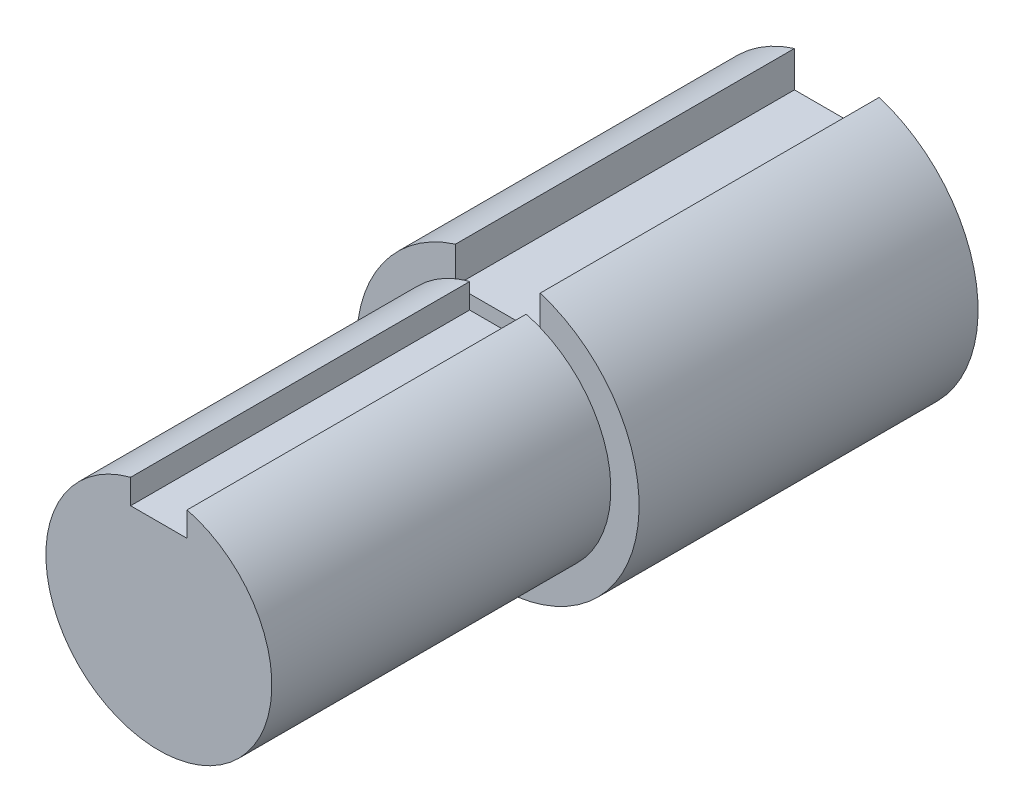
ISO-10303-21;
HEADER;
FILE_DESCRIPTION(('STEP AP214'),'2;1');
FILE_NAME('part.step','',(''),(''),'','','');
FILE_SCHEMA(('AUTOMOTIVE_DESIGN { 1 0 10303 214 1 1 1 1 }'));
ENDSEC;
DATA;
#1=APPLICATION_CONTEXT('core data for automotive mechanical design processes');
#2=APPLICATION_PROTOCOL_DEFINITION('international standard','automotive_design',2000,#1);
#3=PRODUCT_CONTEXT('',#1,'mechanical');
#4=PRODUCT('Part','Part','',(#3));
#5=PRODUCT_RELATED_PRODUCT_CATEGORY('part','',(#4));
#6=PRODUCT_DEFINITION_FORMATION('','',#4);
#7=PRODUCT_DEFINITION_CONTEXT('part definition',#1,'design');
#8=PRODUCT_DEFINITION('design','',#6,#7);
#9=PRODUCT_DEFINITION_SHAPE('','',#8);
#10=(LENGTH_UNIT() NAMED_UNIT(*) SI_UNIT(.MILLI.,.METRE.));
#11=(NAMED_UNIT(*) PLANE_ANGLE_UNIT() SI_UNIT($,.RADIAN.));
#12=(NAMED_UNIT(*) SI_UNIT($,.STERADIAN.) SOLID_ANGLE_UNIT());
#13=UNCERTAINTY_MEASURE_WITH_UNIT(LENGTH_MEASURE(1.E-05),#10,'distance_accuracy_value','');
#14=(GEOMETRIC_REPRESENTATION_CONTEXT(3) GLOBAL_UNCERTAINTY_ASSIGNED_CONTEXT((#13)) GLOBAL_UNIT_ASSIGNED_CONTEXT((#10,
#11,#12)) REPRESENTATION_CONTEXT('',''));
#15=CARTESIAN_POINT('',(0.,0.,0.));
#16=DIRECTION('',(0.,0.,1.));
#17=DIRECTION('',(1.,0.,0.));
#18=AXIS2_PLACEMENT_3D('',#15,#16,#17);
#19=CARTESIAN_POINT('',(0.,0.,19.05));
#20=DIRECTION('',(0.,0.,1.));
#21=DIRECTION('',(1.,0.,0.));
#22=AXIS2_PLACEMENT_3D('',#19,#20,#21);
#23=PLANE('',#22);
#24=CARTESIAN_POINT('',(0.,0.,19.05));
#25=DIRECTION('',(0.,0.,1.));
#26=DIRECTION('',(1.,0.,0.));
#27=AXIS2_PLACEMENT_3D('',#24,#25,#26);
#28=CIRCLE('',#27,6.35);
#29=CARTESIAN_POINT('',(-2.38125,5.88660754913218,19.05));
#30=VERTEX_POINT('',#29);
#31=CARTESIAN_POINT('',(2.38125,5.88660754913218,19.05));
#32=VERTEX_POINT('',#31);
#33=EDGE_CURVE('E11',#30,#32,#28,.T.);
#34=ORIENTED_EDGE('',*,*,#33,.F.);
#35=DIRECTION('',(0.,1.,0.));
#36=VECTOR('',#35,1.);
#37=CARTESIAN_POINT('',(-2.38125,7.57189241124701,19.05));
#38=LINE('',#37,#36);
#39=CARTESIAN_POINT('',(-2.38125,7.57189241124701,19.05));
#40=VERTEX_POINT('',#39);
#41=EDGE_CURVE('E157',#30,#40,#38,.T.);
#42=ORIENTED_EDGE('',*,*,#41,.T.);
#43=CARTESIAN_POINT('',(0.,0.,19.05));
#44=DIRECTION('',(0.,0.,1.));
#45=DIRECTION('',(1.,0.,0.));
#46=AXIS2_PLACEMENT_3D('',#43,#44,#45);
#47=CIRCLE('',#46,7.9375);
#48=CARTESIAN_POINT('',(2.38125,7.57189241124701,19.05));
#49=VERTEX_POINT('',#48);
#50=EDGE_CURVE('E146',#40,#49,#47,.T.);
#51=ORIENTED_EDGE('',*,*,#50,.T.);
#52=DIRECTION('',(0.,-1.,0.));
#53=VECTOR('',#52,1.);
#54=CARTESIAN_POINT('',(2.38125,5.55625,19.05));
#55=LINE('',#54,#53);
#56=EDGE_CURVE('E151',#49,#32,#55,.T.);
#57=ORIENTED_EDGE('',*,*,#56,.T.);
#58=EDGE_LOOP('',(#34,#42,#51,#57));
#59=FACE_BOUND('',#58,.T.);
#60=ADVANCED_FACE('F30',(#59),#23,.T.);
#61=CARTESIAN_POINT('',(0.,0.,19.05));
#62=DIRECTION('',(0.,0.,-1.));
#63=DIRECTION('',(-1.,0.,0.));
#64=AXIS2_PLACEMENT_3D('',#61,#62,#63);
#65=CYLINDRICAL_SURFACE('',#64,7.9375);
#66=CARTESIAN_POINT('',(0.,0.,0.));
#67=DIRECTION('',(0.,0.,1.));
#68=DIRECTION('',(1.,0.,0.));
#69=AXIS2_PLACEMENT_3D('',#66,#67,#68);
#70=CIRCLE('',#69,7.9375);
#71=CARTESIAN_POINT('',(-2.38125,7.57189241124701,0.));
#72=VERTEX_POINT('',#71);
#73=CARTESIAN_POINT('',(2.38125,7.57189241124701,0.));
#74=VERTEX_POINT('',#73);
#75=EDGE_CURVE('E137',#72,#74,#70,.T.);
#76=ORIENTED_EDGE('',*,*,#75,.T.);
#77=DIRECTION('',(0.,0.,-1.));
#78=VECTOR('',#77,1.);
#79=CARTESIAN_POINT('',(2.38125,7.57189241124701,19.05));
#80=LINE('',#79,#78);
#81=EDGE_CURVE('E34',#49,#74,#80,.T.);
#82=ORIENTED_EDGE('',*,*,#81,.F.);
#83=ORIENTED_EDGE('',*,*,#50,.F.);
#84=DIRECTION('',(0.,0.,-1.));
#85=VECTOR('',#84,1.);
#86=CARTESIAN_POINT('',(-2.38125,7.57189241124701,19.05));
#87=LINE('',#86,#85);
#88=EDGE_CURVE('E161',#40,#72,#87,.T.);
#89=ORIENTED_EDGE('',*,*,#88,.T.);
#90=EDGE_LOOP('',(#76,#82,#83,#89));
#91=FACE_BOUND('',#90,.T.);
#92=ADVANCED_FACE('F32',(#91),#65,.T.);
#93=CARTESIAN_POINT('',(2.38125,5.55625,19.05));
#94=DIRECTION('',(1.,0.,0.));
#95=DIRECTION('',(0.,0.,-1.));
#96=AXIS2_PLACEMENT_3D('',#93,#94,#95);
#97=PLANE('',#96);
#98=DIRECTION('',(0.,-1.,0.));
#99=VECTOR('',#98,1.);
#100=CARTESIAN_POINT('',(2.38125,5.55625,0.));
#101=LINE('',#100,#99);
#102=CARTESIAN_POINT('',(2.38125,5.55625,0.));
#103=VERTEX_POINT('',#102);
#104=EDGE_CURVE('E140',#74,#103,#101,.T.);
#105=ORIENTED_EDGE('',*,*,#104,.T.);
#106=DIRECTION('',(0.,0.,-1.));
#107=VECTOR('',#106,1.);
#108=CARTESIAN_POINT('',(2.38125,5.55625,19.05));
#109=LINE('',#108,#107);
#110=CARTESIAN_POINT('',(2.38125,5.55625,19.05));
#111=VERTEX_POINT('',#110);
#112=EDGE_CURVE('E171',#111,#103,#109,.T.);
#113=ORIENTED_EDGE('',*,*,#112,.F.);
#114=EDGE_CURVE('E149',#32,#111,#55,.T.);
#115=ORIENTED_EDGE('',*,*,#114,.F.);
#116=ORIENTED_EDGE('',*,*,#56,.F.);
#117=ORIENTED_EDGE('',*,*,#81,.T.);
#118=EDGE_LOOP('',(#105,#113,#115,#116,#117));
#119=FACE_BOUND('',#118,.T.);
#120=ADVANCED_FACE('F210',(#119),#97,.F.);
#121=CARTESIAN_POINT('',(-2.38125,5.55625,19.05));
#122=DIRECTION('',(0.,-1.,0.));
#123=DIRECTION('',(0.,0.,-1.));
#124=AXIS2_PLACEMENT_3D('',#121,#122,#123);
#125=PLANE('',#124);
#126=DIRECTION('',(-1.,0.,0.));
#127=VECTOR('',#126,1.);
#128=CARTESIAN_POINT('',(-2.38125,5.55625,0.));
#129=LINE('',#128,#127);
#130=CARTESIAN_POINT('',(-2.38125,5.55625,0.));
#131=VERTEX_POINT('',#130);
#132=EDGE_CURVE('E164',#103,#131,#129,.T.);
#133=ORIENTED_EDGE('',*,*,#132,.T.);
#134=DIRECTION('',(0.,0.,-1.));
#135=VECTOR('',#134,1.);
#136=CARTESIAN_POINT('',(-2.38125,5.55625,19.05));
#137=LINE('',#136,#135);
#138=CARTESIAN_POINT('',(-2.38125,5.55625,19.05));
#139=VERTEX_POINT('',#138);
#140=EDGE_CURVE('E169',#139,#131,#137,.T.);
#141=ORIENTED_EDGE('',*,*,#140,.F.);
#142=DIRECTION('',(-1.,0.,0.));
#143=VECTOR('',#142,1.);
#144=CARTESIAN_POINT('',(-2.38125,5.55625,19.05));
#145=LINE('',#144,#143);
#146=CARTESIAN_POINT('',(-1.5875,5.55625,19.05));
#147=VERTEX_POINT('',#146);
#148=EDGE_CURVE('E153',#147,#139,#145,.T.);
#149=ORIENTED_EDGE('',*,*,#148,.F.);
#150=CARTESIAN_POINT('',(1.5875,5.55625,19.05));
#151=VERTEX_POINT('',#150);
#152=EDGE_CURVE('E158',#151,#147,#145,.T.);
#153=ORIENTED_EDGE('',*,*,#152,.F.);
#154=EDGE_CURVE('E154',#111,#151,#145,.T.);
#155=ORIENTED_EDGE('',*,*,#154,.F.);
#156=ORIENTED_EDGE('',*,*,#112,.T.);
#157=EDGE_LOOP('',(#133,#141,#149,#153,#155,#156));
#158=FACE_BOUND('',#157,.T.);
#159=ADVANCED_FACE('F213',(#158),#125,.F.);
#160=CARTESIAN_POINT('',(-2.38125,7.57189241124701,19.05));
#161=DIRECTION('',(-1.,0.,0.));
#162=DIRECTION('',(0.,0.,1.));
#163=AXIS2_PLACEMENT_3D('',#160,#161,#162);
#164=PLANE('',#163);
#165=DIRECTION('',(0.,1.,0.));
#166=VECTOR('',#165,1.);
#167=CARTESIAN_POINT('',(-2.38125,7.57189241124701,0.));
#168=LINE('',#167,#166);
#169=EDGE_CURVE('E150',#131,#72,#168,.T.);
#170=ORIENTED_EDGE('',*,*,#169,.T.);
#171=ORIENTED_EDGE('',*,*,#88,.F.);
#172=ORIENTED_EDGE('',*,*,#41,.F.);
#173=EDGE_CURVE('E159',#139,#30,#38,.T.);
#174=ORIENTED_EDGE('',*,*,#173,.F.);
#175=ORIENTED_EDGE('',*,*,#140,.T.);
#176=EDGE_LOOP('',(#170,#171,#172,#174,#175));
#177=FACE_BOUND('',#176,.T.);
#178=ADVANCED_FACE('F202',(#177),#164,.F.);
#179=DIRECTION('',(0.,1.,0.));
#180=VECTOR('',#179,1.);
#181=CARTESIAN_POINT('',(-1.5875,6.14836106210427,19.05));
#182=LINE('',#181,#180);
#183=CARTESIAN_POINT('',(-1.5875,4.7625,19.05));
#184=VERTEX_POINT('',#183);
#185=EDGE_CURVE('E49',#184,#147,#182,.T.);
#186=ORIENTED_EDGE('',*,*,#185,.F.);
#187=DIRECTION('',(-1.,0.,0.));
#188=VECTOR('',#187,1.);
#189=CARTESIAN_POINT('',(-1.5875,4.7625,19.05));
#190=LINE('',#189,#188);
#191=CARTESIAN_POINT('',(1.5875,4.7625,19.05));
#192=VERTEX_POINT('',#191);
#193=EDGE_CURVE('E182',#192,#184,#190,.T.);
#194=ORIENTED_EDGE('',*,*,#193,.F.);
#195=DIRECTION('',(0.,-1.,0.));
#196=VECTOR('',#195,1.);
#197=CARTESIAN_POINT('',(1.5875,4.7625,19.05));
#198=LINE('',#197,#196);
#199=EDGE_CURVE('E39',#151,#192,#198,.T.);
#200=ORIENTED_EDGE('',*,*,#199,.F.);
#201=ORIENTED_EDGE('',*,*,#152,.T.);
#202=EDGE_LOOP('',(#186,#194,#200,#201));
#203=FACE_BOUND('',#202,.T.);
#204=ADVANCED_FACE('F223',(#203),#23,.T.);
#205=CARTESIAN_POINT('',(0.,0.,0.));
#206=DIRECTION('',(0.,0.,1.));
#207=DIRECTION('',(1.,0.,0.));
#208=AXIS2_PLACEMENT_3D('',#205,#206,#207);
#209=PLANE('',#208);
#210=ORIENTED_EDGE('',*,*,#75,.F.);
#211=ORIENTED_EDGE('',*,*,#169,.F.);
#212=ORIENTED_EDGE('',*,*,#132,.F.);
#213=ORIENTED_EDGE('',*,*,#104,.F.);
#214=EDGE_LOOP('',(#210,#211,#212,#213));
#215=FACE_BOUND('',#214,.T.);
#216=ADVANCED_FACE('F209',(#215),#209,.F.);
#217=CARTESIAN_POINT('',(0.,0.,19.05));
#218=DIRECTION('',(0.,0.,1.));
#219=DIRECTION('',(1.,0.,0.));
#220=AXIS2_PLACEMENT_3D('',#217,#218,#219);
#221=PLANE('',#220);
#222=CARTESIAN_POINT('',(1.5875,6.14836106210427,19.05));
#223=VERTEX_POINT('',#222);
#224=EDGE_CURVE('E42',#32,#223,#28,.T.);
#225=ORIENTED_EDGE('',*,*,#224,.F.);
#226=ORIENTED_EDGE('',*,*,#114,.T.);
#227=ORIENTED_EDGE('',*,*,#154,.T.);
#228=EDGE_CURVE('E180',#223,#151,#198,.T.);
#229=ORIENTED_EDGE('',*,*,#228,.F.);
#230=EDGE_LOOP('',(#225,#226,#227,#229));
#231=FACE_BOUND('',#230,.T.);
#232=ADVANCED_FACE('F215',(#231),#221,.F.);
#233=CARTESIAN_POINT('',(-1.5875,6.14836106210427,19.05));
#234=VERTEX_POINT('',#233);
#235=EDGE_CURVE('E183',#147,#234,#182,.T.);
#236=ORIENTED_EDGE('',*,*,#235,.F.);
#237=ORIENTED_EDGE('',*,*,#148,.T.);
#238=ORIENTED_EDGE('',*,*,#173,.T.);
#239=EDGE_CURVE('E41',#234,#30,#28,.T.);
#240=ORIENTED_EDGE('',*,*,#239,.F.);
#241=EDGE_LOOP('',(#236,#237,#238,#240));
#242=FACE_BOUND('',#241,.T.);
#243=ADVANCED_FACE('F198',(#242),#221,.F.);
#244=CARTESIAN_POINT('',(0.,0.,38.1));
#245=DIRECTION('',(0.,0.,-1.));
#246=DIRECTION('',(-1.,0.,0.));
#247=AXIS2_PLACEMENT_3D('',#244,#245,#246);
#248=CYLINDRICAL_SURFACE('',#247,6.35);
#249=ORIENTED_EDGE('',*,*,#239,.T.);
#250=ORIENTED_EDGE('',*,*,#33,.T.);
#251=ORIENTED_EDGE('',*,*,#224,.T.);
#252=DIRECTION('',(0.,0.,-1.));
#253=VECTOR('',#252,1.);
#254=CARTESIAN_POINT('',(1.5875,6.14836106210427,38.1));
#255=LINE('',#254,#253);
#256=CARTESIAN_POINT('',(1.5875,6.14836106210427,38.1));
#257=VERTEX_POINT('',#256);
#258=EDGE_CURVE('E116',#257,#223,#255,.T.);
#259=ORIENTED_EDGE('',*,*,#258,.F.);
#260=CARTESIAN_POINT('',(0.,0.,38.1));
#261=DIRECTION('',(0.,0.,1.));
#262=DIRECTION('',(1.,0.,0.));
#263=AXIS2_PLACEMENT_3D('',#260,#261,#262);
#264=CIRCLE('',#263,6.35);
#265=CARTESIAN_POINT('',(-1.5875,6.14836106210427,38.1));
#266=VERTEX_POINT('',#265);
#267=EDGE_CURVE('E123',#266,#257,#264,.T.);
#268=ORIENTED_EDGE('',*,*,#267,.F.);
#269=DIRECTION('',(0.,0.,-1.));
#270=VECTOR('',#269,1.);
#271=CARTESIAN_POINT('',(-1.5875,6.14836106210427,38.1));
#272=LINE('',#271,#270);
#273=EDGE_CURVE('E187',#266,#234,#272,.T.);
#274=ORIENTED_EDGE('',*,*,#273,.T.);
#275=EDGE_LOOP('',(#249,#250,#251,#259,#268,#274));
#276=FACE_BOUND('',#275,.T.);
#277=ADVANCED_FACE('F134',(#276),#248,.T.);
#278=CARTESIAN_POINT('',(1.5875,4.7625,38.1));
#279=DIRECTION('',(1.,0.,0.));
#280=DIRECTION('',(0.,0.,-1.));
#281=AXIS2_PLACEMENT_3D('',#278,#279,#280);
#282=PLANE('',#281);
#283=ORIENTED_EDGE('',*,*,#228,.T.);
#284=ORIENTED_EDGE('',*,*,#199,.T.);
#285=DIRECTION('',(0.,0.,-1.));
#286=VECTOR('',#285,1.);
#287=CARTESIAN_POINT('',(1.5875,4.7625,38.1));
#288=LINE('',#287,#286);
#289=CARTESIAN_POINT('',(1.5875,4.7625,38.1));
#290=VERTEX_POINT('',#289);
#291=EDGE_CURVE('E119',#290,#192,#288,.T.);
#292=ORIENTED_EDGE('',*,*,#291,.F.);
#293=DIRECTION('',(0.,-1.,0.));
#294=VECTOR('',#293,1.);
#295=CARTESIAN_POINT('',(1.5875,4.7625,38.1));
#296=LINE('',#295,#294);
#297=EDGE_CURVE('E111',#257,#290,#296,.T.);
#298=ORIENTED_EDGE('',*,*,#297,.F.);
#299=ORIENTED_EDGE('',*,*,#258,.T.);
#300=EDGE_LOOP('',(#283,#284,#292,#298,#299));
#301=FACE_BOUND('',#300,.T.);
#302=ADVANCED_FACE('F114',(#301),#282,.F.);
#303=CARTESIAN_POINT('',(-1.5875,4.7625,38.1));
#304=DIRECTION('',(0.,-1.,0.));
#305=DIRECTION('',(0.,0.,-1.));
#306=AXIS2_PLACEMENT_3D('',#303,#304,#305);
#307=PLANE('',#306);
#308=ORIENTED_EDGE('',*,*,#193,.T.);
#309=DIRECTION('',(0.,0.,-1.));
#310=VECTOR('',#309,1.);
#311=CARTESIAN_POINT('',(-1.5875,4.7625,38.1));
#312=LINE('',#311,#310);
#313=CARTESIAN_POINT('',(-1.5875,4.7625,38.1));
#314=VERTEX_POINT('',#313);
#315=EDGE_CURVE('E142',#314,#184,#312,.T.);
#316=ORIENTED_EDGE('',*,*,#315,.F.);
#317=DIRECTION('',(-1.,0.,0.));
#318=VECTOR('',#317,1.);
#319=CARTESIAN_POINT('',(-1.5875,4.7625,38.1));
#320=LINE('',#319,#318);
#321=EDGE_CURVE('E122',#290,#314,#320,.T.);
#322=ORIENTED_EDGE('',*,*,#321,.F.);
#323=ORIENTED_EDGE('',*,*,#291,.T.);
#324=EDGE_LOOP('',(#308,#316,#322,#323));
#325=FACE_BOUND('',#324,.T.);
#326=ADVANCED_FACE('F191',(#325),#307,.F.);
#327=CARTESIAN_POINT('',(-1.5875,6.14836106210427,38.1));
#328=DIRECTION('',(-1.,0.,0.));
#329=DIRECTION('',(0.,0.,1.));
#330=AXIS2_PLACEMENT_3D('',#327,#328,#329);
#331=PLANE('',#330);
#332=ORIENTED_EDGE('',*,*,#185,.T.);
#333=ORIENTED_EDGE('',*,*,#235,.T.);
#334=ORIENTED_EDGE('',*,*,#273,.F.);
#335=DIRECTION('',(0.,1.,0.));
#336=VECTOR('',#335,1.);
#337=CARTESIAN_POINT('',(-1.5875,6.14836106210427,38.1));
#338=LINE('',#337,#336);
#339=EDGE_CURVE('E128',#314,#266,#338,.T.);
#340=ORIENTED_EDGE('',*,*,#339,.F.);
#341=ORIENTED_EDGE('',*,*,#315,.T.);
#342=EDGE_LOOP('',(#332,#333,#334,#340,#341));
#343=FACE_BOUND('',#342,.T.);
#344=ADVANCED_FACE('F193',(#343),#331,.F.);
#345=CARTESIAN_POINT('',(0.,0.,38.1));
#346=DIRECTION('',(0.,0.,1.));
#347=DIRECTION('',(1.,0.,0.));
#348=AXIS2_PLACEMENT_3D('',#345,#346,#347);
#349=PLANE('',#348);
#350=ORIENTED_EDGE('',*,*,#267,.T.);
#351=ORIENTED_EDGE('',*,*,#297,.T.);
#352=ORIENTED_EDGE('',*,*,#321,.T.);
#353=ORIENTED_EDGE('',*,*,#339,.T.);
#354=EDGE_LOOP('',(#350,#351,#352,#353));
#355=FACE_BOUND('',#354,.T.);
#356=ADVANCED_FACE('F126',(#355),#349,.T.);
#357=CLOSED_SHELL('',(#60,#92,#120,#159,#178,#204,#216,#232,#243,#277,#302,#326,#344,#356));
#358=MANIFOLD_SOLID_BREP('B2',#357);
#359=ADVANCED_BREP_SHAPE_REPRESENTATION('',(#18,#358),#14);
#360=SHAPE_DEFINITION_REPRESENTATION(#9,#359);
ENDSEC;
END-ISO-10303-21;
